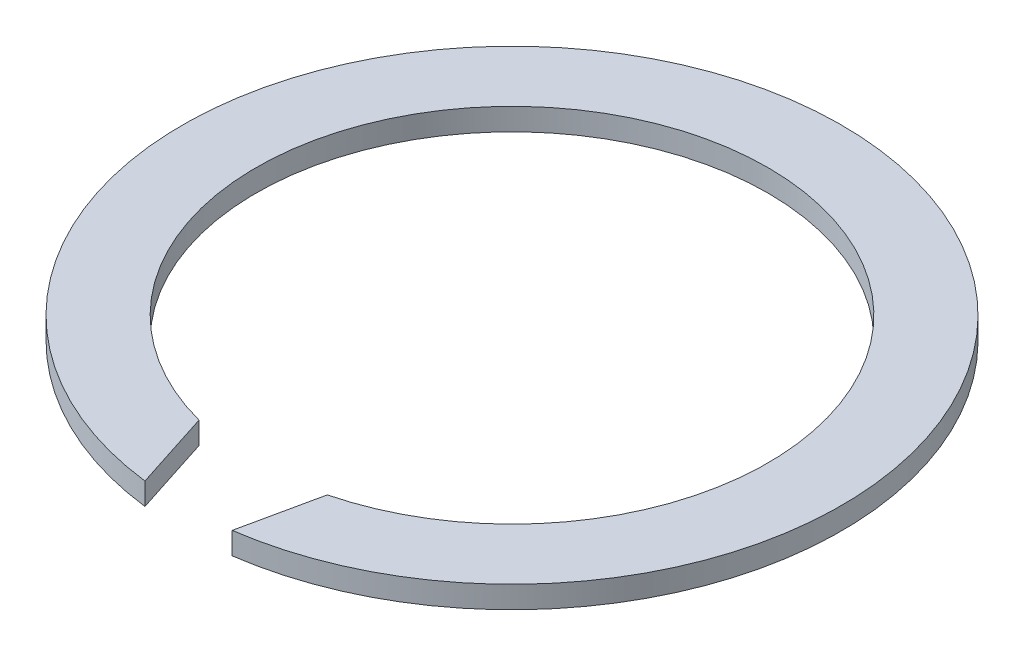
ISO-10303-21;
HEADER;
FILE_DESCRIPTION(('STEP AP214'),'2;1');
FILE_NAME('part.step','',(''),(''),'','','');
FILE_SCHEMA(('AUTOMOTIVE_DESIGN { 1 0 10303 214 1 1 1 1 }'));
ENDSEC;
DATA;
#1=APPLICATION_CONTEXT('core data for automotive mechanical design processes');
#2=APPLICATION_PROTOCOL_DEFINITION('international standard','automotive_design',2000,#1);
#3=PRODUCT_CONTEXT('',#1,'mechanical');
#4=PRODUCT('Part','Part','',(#3));
#5=PRODUCT_RELATED_PRODUCT_CATEGORY('part','',(#4));
#6=PRODUCT_DEFINITION_FORMATION('','',#4);
#7=PRODUCT_DEFINITION_CONTEXT('part definition',#1,'design');
#8=PRODUCT_DEFINITION('design','',#6,#7);
#9=PRODUCT_DEFINITION_SHAPE('','',#8);
#10=(LENGTH_UNIT() NAMED_UNIT(*) SI_UNIT(.MILLI.,.METRE.));
#11=(NAMED_UNIT(*) PLANE_ANGLE_UNIT() SI_UNIT($,.RADIAN.));
#12=(NAMED_UNIT(*) SI_UNIT($,.STERADIAN.) SOLID_ANGLE_UNIT());
#13=UNCERTAINTY_MEASURE_WITH_UNIT(LENGTH_MEASURE(1.E-05),#10,'distance_accuracy_value','');
#14=(GEOMETRIC_REPRESENTATION_CONTEXT(3) GLOBAL_UNCERTAINTY_ASSIGNED_CONTEXT((#13)) GLOBAL_UNIT_ASSIGNED_CONTEXT((#10,
#11,#12)) REPRESENTATION_CONTEXT('',''));
#15=CARTESIAN_POINT('',(0.,0.,0.));
#16=DIRECTION('',(0.,0.,1.));
#17=DIRECTION('',(1.,0.,0.));
#18=AXIS2_PLACEMENT_3D('',#15,#16,#17);
#19=CARTESIAN_POINT('',(0.258665890438927,1.2,2.04241902520982));
#20=DIRECTION('',(0.,-1.,0.));
#21=DIRECTION('',(0.,0.,-1.));
#22=AXIS2_PLACEMENT_3D('',#19,#20,#21);
#23=CYLINDRICAL_SURFACE('',#22,13.9);
#24=CARTESIAN_POINT('',(0.258665890438927,0.,2.04241902520982));
#25=DIRECTION('',(0.,-1.,0.));
#26=DIRECTION('',(0.,0.,1.));
#27=AXIS2_PLACEMENT_3D('',#24,#25,#26);
#28=CIRCLE('',#27,13.9);
#29=CARTESIAN_POINT('',(-3.30989345776354,0.,15.4765317304969));
#30=VERTEX_POINT('',#29);
#31=CARTESIAN_POINT('',(3.69270975316439,0.,15.5115445628562));
#32=VERTEX_POINT('',#31);
#33=EDGE_CURVE('E94',#30,#32,#28,.T.);
#34=ORIENTED_EDGE('',*,*,#33,.T.);
#35=DIRECTION('',(0.,-1.,0.));
#36=VECTOR('',#35,1.);
#37=CARTESIAN_POINT('',(3.69270975316439,1.2,15.5115445628562));
#38=LINE('',#37,#36);
#39=CARTESIAN_POINT('',(3.69270975316439,1.2,15.5115445628562));
#40=VERTEX_POINT('',#39);
#41=EDGE_CURVE('E11',#40,#32,#38,.T.);
#42=ORIENTED_EDGE('',*,*,#41,.F.);
#43=CARTESIAN_POINT('',(0.258665890438927,1.2,2.04241902520982));
#44=DIRECTION('',(0.,-1.,0.));
#45=DIRECTION('',(0.,0.,1.));
#46=AXIS2_PLACEMENT_3D('',#43,#44,#45);
#47=CIRCLE('',#46,13.9);
#48=CARTESIAN_POINT('',(-3.30989345776354,1.2,15.4765317304969));
#49=VERTEX_POINT('',#48);
#50=EDGE_CURVE('E82',#49,#40,#47,.T.);
#51=ORIENTED_EDGE('',*,*,#50,.F.);
#52=DIRECTION('',(0.,-1.,0.));
#53=VECTOR('',#52,1.);
#54=CARTESIAN_POINT('',(-3.30989345776354,1.2,15.4765317304969));
#55=LINE('',#54,#53);
#56=EDGE_CURVE('E90',#49,#30,#55,.T.);
#57=ORIENTED_EDGE('',*,*,#56,.T.);
#58=EDGE_LOOP('',(#34,#42,#51,#57));
#59=FACE_BOUND('',#58,.T.);
#60=ADVANCED_FACE('F31',(#59),#23,.F.);
#61=CARTESIAN_POINT('',(3.69270975316439,1.2,15.5115445628562));
#62=DIRECTION('',(0.977673375482251,0.,0.210130366375596));
#63=DIRECTION('',(0.210130366375596,0.,-0.977673375482251));
#64=AXIS2_PLACEMENT_3D('',#61,#62,#63);
#65=PLANE('',#64);
#66=DIRECTION('',(-0.210130366375596,0.,0.977673375482251));
#67=VECTOR('',#66,1.);
#68=CARTESIAN_POINT('',(3.69270975316439,0.,15.5115445628562));
#69=LINE('',#68,#67);
#70=CARTESIAN_POINT('',(2.778703548336,0.,19.7641404484458));
#71=VERTEX_POINT('',#70);
#72=EDGE_CURVE('E86',#32,#71,#69,.T.);
#73=ORIENTED_EDGE('',*,*,#72,.T.);
#74=DIRECTION('',(0.,-1.,0.));
#75=VECTOR('',#74,1.);
#76=CARTESIAN_POINT('',(2.778703548336,1.2,19.7641404484458));
#77=LINE('',#76,#75);
#78=CARTESIAN_POINT('',(2.778703548336,1.2,19.7641404484458));
#79=VERTEX_POINT('',#78);
#80=EDGE_CURVE('E39',#79,#71,#77,.T.);
#81=ORIENTED_EDGE('',*,*,#80,.F.);
#82=DIRECTION('',(-0.210130366375596,0.,0.977673375482251));
#83=VECTOR('',#82,1.);
#84=CARTESIAN_POINT('',(3.69270975316439,1.2,15.5115445628562));
#85=LINE('',#84,#83);
#86=EDGE_CURVE('E77',#40,#79,#85,.T.);
#87=ORIENTED_EDGE('',*,*,#86,.F.);
#88=ORIENTED_EDGE('',*,*,#41,.T.);
#89=EDGE_LOOP('',(#73,#81,#87,#88));
#90=FACE_BOUND('',#89,.T.);
#91=ADVANCED_FACE('F85',(#90),#65,.F.);
#92=CARTESIAN_POINT('',(0.258665890438927,1.2,2.04241902520982));
#93=DIRECTION('',(0.,-1.,0.));
#94=DIRECTION('',(0.,0.,-1.));
#95=AXIS2_PLACEMENT_3D('',#92,#93,#94);
#96=CYLINDRICAL_SURFACE('',#95,17.9);
#97=CARTESIAN_POINT('',(0.258665890438927,0.,2.04241902520982));
#98=DIRECTION('',(0.,1.,0.));
#99=DIRECTION('',(0.,0.,1.));
#100=AXIS2_PLACEMENT_3D('',#97,#98,#99);
#101=CIRCLE('',#100,17.9);
#102=CARTESIAN_POINT('',(-1.91354971998938,0.,19.8101279192066));
#103=VERTEX_POINT('',#102);
#104=EDGE_CURVE('E64',#71,#103,#101,.T.);
#105=ORIENTED_EDGE('',*,*,#104,.T.);
#106=DIRECTION('',(0.,-1.,0.));
#107=VECTOR('',#106,1.);
#108=CARTESIAN_POINT('',(-1.91354971998938,1.2,19.8101279192066));
#109=LINE('',#108,#107);
#110=CARTESIAN_POINT('',(-1.91354971998938,1.2,19.8101279192066));
#111=VERTEX_POINT('',#110);
#112=EDGE_CURVE('E87',#111,#103,#109,.T.);
#113=ORIENTED_EDGE('',*,*,#112,.F.);
#114=CARTESIAN_POINT('',(0.258665890438927,1.2,2.04241902520982));
#115=DIRECTION('',(0.,1.,0.));
#116=DIRECTION('',(0.,0.,1.));
#117=AXIS2_PLACEMENT_3D('',#114,#115,#116);
#118=CIRCLE('',#117,17.9);
#119=EDGE_CURVE('E80',#79,#111,#118,.T.);
#120=ORIENTED_EDGE('',*,*,#119,.F.);
#121=ORIENTED_EDGE('',*,*,#80,.T.);
#122=EDGE_LOOP('',(#105,#113,#120,#121));
#123=FACE_BOUND('',#122,.T.);
#124=ADVANCED_FACE('F88',(#123),#96,.T.);
#125=CARTESIAN_POINT('',(-3.30989345776354,1.2,15.4765317304969));
#126=DIRECTION('',(-0.951810632466648,0.,0.306686354315676));
#127=DIRECTION('',(0.306686354315676,0.,0.951810632466648));
#128=AXIS2_PLACEMENT_3D('',#125,#126,#127);
#129=PLANE('',#128);
#130=DIRECTION('',(-0.306686354315676,0.,-0.951810632466648));
#131=VECTOR('',#130,1.);
#132=CARTESIAN_POINT('',(-3.30989345776354,0.,15.4765317304969));
#133=LINE('',#132,#131);
#134=EDGE_CURVE('E70',#103,#30,#133,.T.);
#135=ORIENTED_EDGE('',*,*,#134,.T.);
#136=ORIENTED_EDGE('',*,*,#56,.F.);
#137=DIRECTION('',(-0.306686354315676,0.,-0.951810632466648));
#138=VECTOR('',#137,1.);
#139=CARTESIAN_POINT('',(-3.30989345776354,1.2,15.4765317304969));
#140=LINE('',#139,#138);
#141=EDGE_CURVE('E47',#111,#49,#140,.T.);
#142=ORIENTED_EDGE('',*,*,#141,.F.);
#143=ORIENTED_EDGE('',*,*,#112,.T.);
#144=EDGE_LOOP('',(#135,#136,#142,#143));
#145=FACE_BOUND('',#144,.T.);
#146=ADVANCED_FACE('F101',(#145),#129,.F.);
#147=CARTESIAN_POINT('',(0.258665890438927,1.2,2.04241902520982));
#148=DIRECTION('',(0.,1.,0.));
#149=DIRECTION('',(0.,0.,1.));
#150=AXIS2_PLACEMENT_3D('',#147,#148,#149);
#151=PLANE('',#150);
#152=ORIENTED_EDGE('',*,*,#50,.T.);
#153=ORIENTED_EDGE('',*,*,#86,.T.);
#154=ORIENTED_EDGE('',*,*,#119,.T.);
#155=ORIENTED_EDGE('',*,*,#141,.T.);
#156=EDGE_LOOP('',(#152,#153,#154,#155));
#157=FACE_BOUND('',#156,.T.);
#158=ADVANCED_FACE('F78',(#157),#151,.T.);
#159=CARTESIAN_POINT('',(0.258665890438927,0.,2.04241902520982));
#160=DIRECTION('',(0.,1.,0.));
#161=DIRECTION('',(0.,0.,1.));
#162=AXIS2_PLACEMENT_3D('',#159,#160,#161);
#163=PLANE('',#162);
#164=ORIENTED_EDGE('',*,*,#33,.F.);
#165=ORIENTED_EDGE('',*,*,#134,.F.);
#166=ORIENTED_EDGE('',*,*,#104,.F.);
#167=ORIENTED_EDGE('',*,*,#72,.F.);
#168=EDGE_LOOP('',(#164,#165,#166,#167));
#169=FACE_BOUND('',#168,.T.);
#170=ADVANCED_FACE('F104',(#169),#163,.F.);
#171=CLOSED_SHELL('',(#60,#91,#124,#146,#158,#170));
#172=MANIFOLD_SOLID_BREP('B2',#171);
#173=ADVANCED_BREP_SHAPE_REPRESENTATION('',(#18,#172),#14);
#174=SHAPE_DEFINITION_REPRESENTATION(#9,#173);
ENDSEC;
END-ISO-10303-21;
